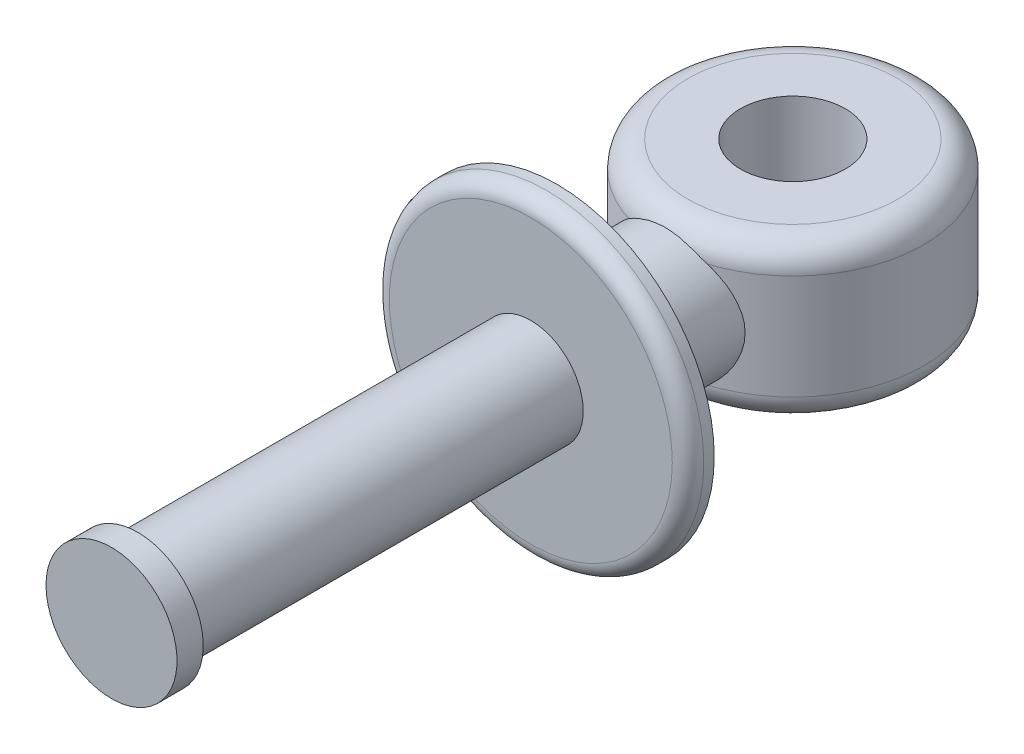
ISO-10303-21;
HEADER;
FILE_DESCRIPTION(('STEP AP214'),'2;1');
FILE_NAME('part.step','',(''),(''),'','','');
FILE_SCHEMA(('AUTOMOTIVE_DESIGN { 1 0 10303 214 1 1 1 1 }'));
ENDSEC;
DATA;
#1=APPLICATION_CONTEXT('core data for automotive mechanical design processes');
#2=APPLICATION_PROTOCOL_DEFINITION('international standard','automotive_design',2000,#1);
#3=PRODUCT_CONTEXT('',#1,'mechanical');
#4=PRODUCT('Part','Part','',(#3));
#5=PRODUCT_RELATED_PRODUCT_CATEGORY('part','',(#4));
#6=PRODUCT_DEFINITION_FORMATION('','',#4);
#7=PRODUCT_DEFINITION_CONTEXT('part definition',#1,'design');
#8=PRODUCT_DEFINITION('design','',#6,#7);
#9=PRODUCT_DEFINITION_SHAPE('','',#8);
#10=(LENGTH_UNIT() NAMED_UNIT(*) SI_UNIT(.MILLI.,.METRE.));
#11=(NAMED_UNIT(*) PLANE_ANGLE_UNIT() SI_UNIT($,.RADIAN.));
#12=(NAMED_UNIT(*) SI_UNIT($,.STERADIAN.) SOLID_ANGLE_UNIT());
#13=UNCERTAINTY_MEASURE_WITH_UNIT(LENGTH_MEASURE(1.E-05),#10,'distance_accuracy_value','');
#14=(GEOMETRIC_REPRESENTATION_CONTEXT(3) GLOBAL_UNCERTAINTY_ASSIGNED_CONTEXT((#13)) GLOBAL_UNIT_ASSIGNED_CONTEXT((#10,
#11,#12)) REPRESENTATION_CONTEXT('',''));
#15=CARTESIAN_POINT('',(0.,0.,0.));
#16=DIRECTION('',(0.,0.,1.));
#17=DIRECTION('',(1.,0.,0.));
#18=AXIS2_PLACEMENT_3D('',#15,#16,#17);
#19=CARTESIAN_POINT('',(0.,7.5,-62.5));
#20=DIRECTION('',(0.,-1.,0.));
#21=DIRECTION('',(0.,0.,1.));
#22=AXIS2_PLACEMENT_3D('',#19,#20,#21);
#23=CYLINDRICAL_SURFACE('',#22,12.5);
#24=CARTESIAN_POINT('',(0.,-5.,-62.5));
#25=DIRECTION('',(0.,-1.,0.));
#26=DIRECTION('',(0.,0.,-1.));
#27=AXIS2_PLACEMENT_3D('',#24,#25,#26);
#28=CIRCLE('',#27,12.5);
#29=CARTESIAN_POINT('',(0.,-5.,-75.));
#30=VERTEX_POINT('',#29);
#31=EDGE_CURVE('E54',#30,#30,#28,.T.);
#32=ORIENTED_EDGE('',*,*,#31,.F.);
#33=EDGE_LOOP('',(#32));
#34=FACE_BOUND('',#33,.T.);
#35=CARTESIAN_POINT('',(0.,5.,-62.5));
#36=DIRECTION('',(0.,-1.,0.));
#37=DIRECTION('',(0.,0.,-1.));
#38=AXIS2_PLACEMENT_3D('',#35,#36,#37);
#39=CIRCLE('',#38,12.5);
#40=CARTESIAN_POINT('',(0.,5.,-75.));
#41=VERTEX_POINT('',#40);
#42=EDGE_CURVE('E58',#41,#41,#39,.F.);
#43=ORIENTED_EDGE('',*,*,#42,.F.);
#44=EDGE_LOOP('',(#43));
#45=FACE_BOUND('',#44,.T.);
#46=ADVANCED_FACE('F43',(#34,#45),#23,.T.);
#47=CARTESIAN_POINT('',(0.,7.5,-62.5));
#48=DIRECTION('',(0.,1.,0.));
#49=DIRECTION('',(0.,0.,-1.));
#50=AXIS2_PLACEMENT_3D('',#47,#48,#49);
#51=PLANE('',#50);
#52=CARTESIAN_POINT('',(0.,7.5,-62.5));
#53=DIRECTION('',(0.,-1.,0.));
#54=DIRECTION('',(0.,0.,-1.));
#55=AXIS2_PLACEMENT_3D('',#52,#53,#54);
#56=CIRCLE('',#55,10.);
#57=CARTESIAN_POINT('',(0.,7.5,-72.5));
#58=VERTEX_POINT('',#57);
#59=EDGE_CURVE('E11',#58,#58,#56,.T.);
#60=ORIENTED_EDGE('',*,*,#59,.F.);
#61=EDGE_LOOP('',(#60));
#62=FACE_BOUND('',#61,.T.);
#63=CARTESIAN_POINT('',(0.,7.5,-62.5));
#64=DIRECTION('',(0.,-1.,0.));
#65=DIRECTION('',(0.,0.,-1.));
#66=AXIS2_PLACEMENT_3D('',#63,#64,#65);
#67=CIRCLE('',#66,5.);
#68=CARTESIAN_POINT('',(0.,7.5,-67.5));
#69=VERTEX_POINT('',#68);
#70=EDGE_CURVE('E66',#69,#69,#67,.T.);
#71=ORIENTED_EDGE('',*,*,#70,.T.);
#72=EDGE_LOOP('',(#71));
#73=FACE_BOUND('',#72,.T.);
#74=ADVANCED_FACE('F70',(#62,#73),#51,.T.);
#75=CARTESIAN_POINT('',(0.,-7.5,-62.5));
#76=DIRECTION('',(0.,1.,0.));
#77=DIRECTION('',(0.,0.,-1.));
#78=AXIS2_PLACEMENT_3D('',#75,#76,#77);
#79=PLANE('',#78);
#80=CARTESIAN_POINT('',(0.,-7.5,-62.5));
#81=DIRECTION('',(0.,-1.,0.));
#82=DIRECTION('',(0.,0.,-1.));
#83=AXIS2_PLACEMENT_3D('',#80,#81,#82);
#84=CIRCLE('',#83,10.);
#85=CARTESIAN_POINT('',(0.,-7.5,-72.5));
#86=VERTEX_POINT('',#85);
#87=EDGE_CURVE('E50',#86,#86,#84,.F.);
#88=ORIENTED_EDGE('',*,*,#87,.F.);
#89=EDGE_LOOP('',(#88));
#90=FACE_BOUND('',#89,.T.);
#91=CARTESIAN_POINT('',(0.,-7.5,-62.5));
#92=DIRECTION('',(0.,-1.,0.));
#93=DIRECTION('',(0.,0.,-1.));
#94=AXIS2_PLACEMENT_3D('',#91,#92,#93);
#95=CIRCLE('',#94,5.);
#96=CARTESIAN_POINT('',(0.,-7.5,-67.5));
#97=VERTEX_POINT('',#96);
#98=EDGE_CURVE('E63',#97,#97,#95,.T.);
#99=ORIENTED_EDGE('',*,*,#98,.F.);
#100=EDGE_LOOP('',(#99));
#101=FACE_BOUND('',#100,.T.);
#102=ADVANCED_FACE('F76',(#90,#101),#79,.F.);
#103=CARTESIAN_POINT('',(0.,-15.,-62.5));
#104=DIRECTION('',(0.,1.,0.));
#105=DIRECTION('',(0.,0.,-1.));
#106=AXIS2_PLACEMENT_3D('',#103,#104,#105);
#107=CYLINDRICAL_SURFACE('',#106,5.);
#108=CARTESIAN_POINT('',(0.,7.5,-67.5));
#109=CARTESIAN_POINT('',(0.,7.34375,-67.5));
#110=CARTESIAN_POINT('',(0.,7.1875,-67.5));
#111=CARTESIAN_POINT('',(0.,6.875,-67.5));
#112=CARTESIAN_POINT('',(0.,6.71875,-67.5));
#113=CARTESIAN_POINT('',(0.,6.40625,-67.5));
#114=CARTESIAN_POINT('',(0.,6.25,-67.5));
#115=CARTESIAN_POINT('',(0.,5.9375,-67.5));
#116=CARTESIAN_POINT('',(0.,5.78125,-67.5));
#117=CARTESIAN_POINT('',(0.,5.46875,-67.5));
#118=CARTESIAN_POINT('',(0.,5.3125,-67.5));
#119=CARTESIAN_POINT('',(0.,5.,-67.5));
#120=CARTESIAN_POINT('',(0.,4.84375,-67.5));
#121=CARTESIAN_POINT('',(0.,4.53125,-67.5));
#122=CARTESIAN_POINT('',(0.,4.375,-67.5));
#123=CARTESIAN_POINT('',(0.,4.0625,-67.5));
#124=CARTESIAN_POINT('',(0.,3.90625,-67.5));
#125=CARTESIAN_POINT('',(0.,3.59375,-67.5));
#126=CARTESIAN_POINT('',(0.,3.4375,-67.5));
#127=CARTESIAN_POINT('',(0.,3.125,-67.5));
#128=CARTESIAN_POINT('',(0.,2.96875,-67.5));
#129=CARTESIAN_POINT('',(0.,2.65625,-67.5));
#130=CARTESIAN_POINT('',(0.,2.5,-67.5));
#131=CARTESIAN_POINT('',(0.,2.1875,-67.5));
#132=CARTESIAN_POINT('',(0.,2.03125,-67.5));
#133=CARTESIAN_POINT('',(0.,1.71875,-67.5));
#134=CARTESIAN_POINT('',(0.,1.5625,-67.5));
#135=CARTESIAN_POINT('',(0.,1.25,-67.5));
#136=CARTESIAN_POINT('',(0.,1.09375,-67.5));
#137=CARTESIAN_POINT('',(0.,0.781250000000001,-67.5));
#138=CARTESIAN_POINT('',(0.,0.625000000000002,-67.5));
#139=CARTESIAN_POINT('',(0.,0.312500000000002,-67.5));
#140=CARTESIAN_POINT('',(0.,0.156250000000002,-67.5));
#141=CARTESIAN_POINT('',(0.,-0.156249999999998,-67.5));
#142=CARTESIAN_POINT('',(0.,-0.312499999999997,-67.5));
#143=CARTESIAN_POINT('',(0.,-0.624999999999997,-67.5));
#144=CARTESIAN_POINT('',(0.,-0.781249999999997,-67.5));
#145=CARTESIAN_POINT('',(0.,-1.09375,-67.5));
#146=CARTESIAN_POINT('',(0.,-1.25,-67.5));
#147=CARTESIAN_POINT('',(0.,-1.5625,-67.5));
#148=CARTESIAN_POINT('',(0.,-1.71875,-67.5));
#149=CARTESIAN_POINT('',(0.,-2.03125,-67.5));
#150=CARTESIAN_POINT('',(0.,-2.1875,-67.5));
#151=CARTESIAN_POINT('',(0.,-2.5,-67.5));
#152=CARTESIAN_POINT('',(0.,-2.65625,-67.5));
#153=CARTESIAN_POINT('',(0.,-2.96875,-67.5));
#154=CARTESIAN_POINT('',(0.,-3.125,-67.5));
#155=CARTESIAN_POINT('',(0.,-3.4375,-67.5));
#156=CARTESIAN_POINT('',(0.,-3.59375,-67.5));
#157=CARTESIAN_POINT('',(0.,-3.90625,-67.5));
#158=CARTESIAN_POINT('',(0.,-4.0625,-67.5));
#159=CARTESIAN_POINT('',(0.,-4.375,-67.5));
#160=CARTESIAN_POINT('',(0.,-4.53125,-67.5));
#161=CARTESIAN_POINT('',(0.,-4.84375,-67.5));
#162=CARTESIAN_POINT('',(0.,-5.,-67.5));
#163=CARTESIAN_POINT('',(0.,-5.3125,-67.5));
#164=CARTESIAN_POINT('',(0.,-5.46875,-67.5));
#165=CARTESIAN_POINT('',(0.,-5.78125,-67.5));
#166=CARTESIAN_POINT('',(0.,-5.9375,-67.5));
#167=CARTESIAN_POINT('',(0.,-6.25,-67.5));
#168=CARTESIAN_POINT('',(0.,-6.40625,-67.5));
#169=CARTESIAN_POINT('',(0.,-6.71875,-67.5));
#170=CARTESIAN_POINT('',(0.,-6.875,-67.5));
#171=CARTESIAN_POINT('',(0.,-7.1875,-67.5));
#172=CARTESIAN_POINT('',(0.,-7.34375,-67.5));
#173=CARTESIAN_POINT('',(0.,-7.5,-67.5));
#174=B_SPLINE_CURVE_WITH_KNOTS('',3,(#108,#109,#110,#111,#112,#113,#114,#115,#116,#117,#118,
#119,#120,#121,#122,#123,#124,#125,#126,#127,#128,#129,#130,#131,#132,#133,#134,#135,#136,#137,
#138,#139,#140,#141,#142,#143,#144,#145,#146,#147,#148,#149,#150,#151,#152,#153,#154,#155,#156,
#157,#158,#159,#160,#161,#162,#163,#164,#165,#166,#167,#168,#169,#170,#171,#172,#173),
.UNSPECIFIED.,.F.,.F.,(4,2,2,2,2,2,2,2,2,2,2,2,2,2,2,2,2,2,2,2,2,2,2,2,2,2,2,2,2,2,2,2,4),(0.,
0.46875,0.937500000000001,1.40625,1.875,2.34375,2.8125,3.28125,3.75,4.21875,4.6875,5.15625,
5.625,6.09375,6.5625,7.03125,7.5,7.96875,8.4375,8.90625,9.375,9.84375,10.3125,10.78125,11.25,
11.71875,12.1875,12.65625,13.125,13.59375,14.0625,14.53125,15.),.UNSPECIFIED.);
#175=EDGE_CURVE('BSEAM72',#69,#97,#174,.T.);
#176=ORIENTED_EDGE('',*,*,#70,.F.);
#177=ORIENTED_EDGE('',*,*,#98,.T.);
#178=ORIENTED_EDGE('',*,*,#175,.T.);
#179=ORIENTED_EDGE('',*,*,#175,.F.);
#180=EDGE_LOOP('',(#176,#178,#177,#179));
#181=FACE_BOUND('',#180,.T.);
#182=ADVANCED_FACE('F72',(#181),#107,.F.);
#183=CARTESIAN_POINT('',(0.,-5.,-62.5));
#184=DIRECTION('',(0.,1.,0.));
#185=DIRECTION('',(0.,0.,-1.));
#186=AXIS2_PLACEMENT_3D('',#183,#184,#185);
#187=TOROIDAL_SURFACE('',#186,10.,2.5);
#188=ORIENTED_EDGE('',*,*,#87,.T.);
#189=EDGE_LOOP('',(#188));
#190=FACE_BOUND('',#189,.T.);
#191=ORIENTED_EDGE('',*,*,#31,.T.);
#192=EDGE_LOOP('',(#191));
#193=FACE_BOUND('',#192,.T.);
#194=ADVANCED_FACE('F75',(#190,#193),#187,.T.);
#195=CARTESIAN_POINT('',(0.,5.,-62.5));
#196=DIRECTION('',(0.,1.,0.));
#197=DIRECTION('',(0.,0.,-1.));
#198=AXIS2_PLACEMENT_3D('',#195,#196,#197);
#199=TOROIDAL_SURFACE('',#198,10.,2.5);
#200=ORIENTED_EDGE('',*,*,#42,.T.);
#201=EDGE_LOOP('',(#200));
#202=FACE_BOUND('',#201,.T.);
#203=ORIENTED_EDGE('',*,*,#59,.T.);
#204=EDGE_LOOP('',(#203));
#205=FACE_BOUND('',#204,.T.);
#206=ADVANCED_FACE('F45',(#202,#205),#199,.T.);
#207=CLOSED_SHELL('',(#46,#74,#102,#182,#194,#206));
#208=MANIFOLD_SOLID_BREP('B2',#207);
#209=CARTESIAN_POINT('',(0.,0.,-40.));
#210=DIRECTION('',(0.,0.,-1.));
#211=DIRECTION('',(1.,0.,0.));
#212=AXIS2_PLACEMENT_3D('',#209,#210,#211);
#213=PLANE('',#212);
#214=CARTESIAN_POINT('',(0.,0.,-40.));
#215=DIRECTION('',(0.,0.,1.));
#216=DIRECTION('',(1.,0.,0.));
#217=AXIS2_PLACEMENT_3D('',#214,#215,#216);
#218=CIRCLE('',#217,8.75);
#219=CARTESIAN_POINT('',(8.75,0.,-40.));
#220=VERTEX_POINT('',#219);
#221=EDGE_CURVE('E146',#220,#220,#218,.F.);
#222=ORIENTED_EDGE('',*,*,#221,.F.);
#223=EDGE_LOOP('',(#222));
#224=FACE_BOUND('',#223,.T.);
#225=CARTESIAN_POINT('',(0.,0.,-40.));
#226=DIRECTION('',(0.,0.,1.));
#227=DIRECTION('',(1.,0.,0.));
#228=AXIS2_PLACEMENT_3D('',#225,#226,#227);
#229=CIRCLE('',#228,15.);
#230=CARTESIAN_POINT('',(15.,0.,-40.));
#231=VERTEX_POINT('',#230);
#232=EDGE_CURVE('E165',#231,#231,#229,.T.);
#233=ORIENTED_EDGE('',*,*,#232,.F.);
#234=EDGE_LOOP('',(#233));
#235=FACE_BOUND('',#234,.T.);
#236=ADVANCED_FACE('F135',(#224,#235),#213,.T.);
#237=CARTESIAN_POINT('',(0.,0.,-37.5));
#238=DIRECTION('',(0.,0.,1.));
#239=DIRECTION('',(-1.,0.,0.));
#240=AXIS2_PLACEMENT_3D('',#237,#238,#239);
#241=CYLINDRICAL_SURFACE('',#240,5.);
#242=CARTESIAN_POINT('',(0.,0.,-37.5));
#243=DIRECTION('',(0.,0.,1.));
#244=DIRECTION('',(1.,0.,0.));
#245=AXIS2_PLACEMENT_3D('',#242,#243,#244);
#246=CIRCLE('',#245,5.);
#247=CARTESIAN_POINT('',(5.,0.,-37.5));
#248=VERTEX_POINT('',#247);
#249=EDGE_CURVE('E155',#248,#248,#246,.T.);
#250=ORIENTED_EDGE('',*,*,#249,.T.);
#251=EDGE_LOOP('',(#250));
#252=FACE_BOUND('',#251,.T.);
#253=CARTESIAN_POINT('',(0.,0.,0.));
#254=DIRECTION('',(0.,0.,-1.));
#255=DIRECTION('',(-1.,0.,0.));
#256=AXIS2_PLACEMENT_3D('',#253,#254,#255);
#257=CIRCLE('',#256,5.);
#258=CARTESIAN_POINT('',(-5.,0.,0.));
#259=VERTEX_POINT('',#258);
#260=EDGE_CURVE('E158',#259,#259,#257,.T.);
#261=ORIENTED_EDGE('',*,*,#260,.T.);
#262=EDGE_LOOP('',(#261));
#263=FACE_BOUND('',#262,.T.);
#264=ADVANCED_FACE('F189',(#252,#263),#241,.T.);
#265=CARTESIAN_POINT('',(0.,0.,0.));
#266=DIRECTION('',(0.,0.,1.));
#267=DIRECTION('',(-1.,0.,0.));
#268=AXIS2_PLACEMENT_3D('',#265,#266,#267);
#269=PLANE('',#268);
#270=CARTESIAN_POINT('',(0.,0.,0.));
#271=DIRECTION('',(0.,0.,-1.));
#272=DIRECTION('',(-1.,0.,0.));
#273=AXIS2_PLACEMENT_3D('',#270,#271,#272);
#274=CIRCLE('',#273,6.25);
#275=CARTESIAN_POINT('',(-6.25,0.,0.));
#276=VERTEX_POINT('',#275);
#277=EDGE_CURVE('E162',#276,#276,#274,.T.);
#278=ORIENTED_EDGE('',*,*,#277,.T.);
#279=EDGE_LOOP('',(#278));
#280=FACE_BOUND('',#279,.T.);
#281=ORIENTED_EDGE('',*,*,#260,.F.);
#282=EDGE_LOOP('',(#281));
#283=FACE_BOUND('',#282,.T.);
#284=ADVANCED_FACE('F195',(#280,#283),#269,.F.);
#285=CARTESIAN_POINT('',(0.,0.,2.5));
#286=DIRECTION('',(0.,0.,-1.));
#287=DIRECTION('',(1.,0.,0.));
#288=AXIS2_PLACEMENT_3D('',#285,#286,#287);
#289=CYLINDRICAL_SURFACE('',#288,6.25);
#290=CARTESIAN_POINT('',(0.,0.,2.5));
#291=DIRECTION('',(0.,0.,-1.));
#292=DIRECTION('',(-1.,0.,0.));
#293=AXIS2_PLACEMENT_3D('',#290,#291,#292);
#294=CIRCLE('',#293,6.25);
#295=CARTESIAN_POINT('',(-6.25,0.,2.5));
#296=VERTEX_POINT('',#295);
#297=EDGE_CURVE('E161',#296,#296,#294,.T.);
#298=ORIENTED_EDGE('',*,*,#297,.T.);
#299=EDGE_LOOP('',(#298));
#300=FACE_BOUND('',#299,.T.);
#301=ORIENTED_EDGE('',*,*,#277,.F.);
#302=EDGE_LOOP('',(#301));
#303=FACE_BOUND('',#302,.T.);
#304=ADVANCED_FACE('F211',(#300,#303),#289,.T.);
#305=CARTESIAN_POINT('',(0.,0.,2.5));
#306=DIRECTION('',(0.,0.,1.));
#307=DIRECTION('',(-1.,0.,0.));
#308=AXIS2_PLACEMENT_3D('',#305,#306,#307);
#309=PLANE('',#308);
#310=ORIENTED_EDGE('',*,*,#297,.F.);
#311=EDGE_LOOP('',(#310));
#312=FACE_BOUND('',#311,.T.);
#313=ADVANCED_FACE('F204',(#312),#309,.T.);
#314=CARTESIAN_POINT('',(0.,0.,-37.5));
#315=DIRECTION('',(0.,0.,-1.));
#316=DIRECTION('',(1.,0.,0.));
#317=AXIS2_PLACEMENT_3D('',#314,#315,#316);
#318=PLANE('',#317);
#319=CARTESIAN_POINT('',(0.,0.,-37.5));
#320=DIRECTION('',(0.,0.,1.));
#321=DIRECTION('',(1.,0.,0.));
#322=AXIS2_PLACEMENT_3D('',#319,#320,#321);
#323=CIRCLE('',#322,13.5);
#324=CARTESIAN_POINT('',(13.5,0.,-37.5));
#325=VERTEX_POINT('',#324);
#326=EDGE_CURVE('E42',#325,#325,#323,.F.);
#327=ORIENTED_EDGE('',*,*,#326,.F.);
#328=EDGE_LOOP('',(#327));
#329=FACE_BOUND('',#328,.T.);
#330=ORIENTED_EDGE('',*,*,#249,.F.);
#331=EDGE_LOOP('',(#330));
#332=FACE_BOUND('',#331,.T.);
#333=ADVANCED_FACE('F201',(#329,#332),#318,.F.);
#334=CARTESIAN_POINT('',(0.,0.,-40.));
#335=DIRECTION('',(0.,0.,1.));
#336=DIRECTION('',(-1.,0.,0.));
#337=AXIS2_PLACEMENT_3D('',#334,#335,#336);
#338=CYLINDRICAL_SURFACE('',#337,15.);
#339=CARTESIAN_POINT('',(0.,0.,-39.));
#340=DIRECTION('',(0.,0.,1.));
#341=DIRECTION('',(1.,0.,0.));
#342=AXIS2_PLACEMENT_3D('',#339,#340,#341);
#343=CIRCLE('',#342,15.);
#344=CARTESIAN_POINT('',(15.,0.,-39.));
#345=VERTEX_POINT('',#344);
#346=EDGE_CURVE('E142',#345,#345,#343,.T.);
#347=ORIENTED_EDGE('',*,*,#346,.F.);
#348=EDGE_LOOP('',(#347));
#349=FACE_BOUND('',#348,.T.);
#350=ORIENTED_EDGE('',*,*,#232,.T.);
#351=EDGE_LOOP('',(#350));
#352=FACE_BOUND('',#351,.T.);
#353=ADVANCED_FACE('F185',(#349,#352),#338,.T.);
#354=CARTESIAN_POINT('',(0.,0.,-55.));
#355=DIRECTION('',(0.,0.,1.));
#356=DIRECTION('',(-1.,0.,0.));
#357=AXIS2_PLACEMENT_3D('',#354,#355,#356);
#358=CYLINDRICAL_SURFACE('',#357,6.25);
#359=CARTESIAN_POINT('',(0.,0.,-42.5));
#360=DIRECTION('',(0.,0.,1.));
#361=DIRECTION('',(1.,0.,0.));
#362=AXIS2_PLACEMENT_3D('',#359,#360,#361);
#363=CIRCLE('',#362,6.25);
#364=CARTESIAN_POINT('',(6.25,0.,-42.5));
#365=VERTEX_POINT('',#364);
#366=EDGE_CURVE('E150',#365,#365,#363,.T.);
#367=ORIENTED_EDGE('',*,*,#366,.F.);
#368=EDGE_LOOP('',(#367));
#369=FACE_BOUND('',#368,.T.);
#370=CARTESIAN_POINT('',(0.,0.,-55.));
#371=DIRECTION('',(0.,0.,1.));
#372=DIRECTION('',(1.,0.,0.));
#373=AXIS2_PLACEMENT_3D('',#370,#371,#372);
#374=CIRCLE('',#373,6.25);
#375=CARTESIAN_POINT('',(6.25,0.,-55.));
#376=VERTEX_POINT('',#375);
#377=EDGE_CURVE('E170',#376,#376,#374,.T.);
#378=ORIENTED_EDGE('',*,*,#377,.T.);
#379=EDGE_LOOP('',(#378));
#380=FACE_BOUND('',#379,.T.);
#381=ADVANCED_FACE('F174',(#369,#380),#358,.T.);
#382=CARTESIAN_POINT('',(0.,0.,-55.));
#383=DIRECTION('',(0.,0.,-1.));
#384=DIRECTION('',(1.,0.,0.));
#385=AXIS2_PLACEMENT_3D('',#382,#383,#384);
#386=PLANE('',#385);
#387=ORIENTED_EDGE('',*,*,#377,.F.);
#388=EDGE_LOOP('',(#387));
#389=FACE_BOUND('',#388,.T.);
#390=ADVANCED_FACE('F176',(#389),#386,.T.);
#391=CARTESIAN_POINT('',(0.,0.,-42.5));
#392=DIRECTION('',(0.,0.,-1.));
#393=DIRECTION('',(1.,0.,0.));
#394=AXIS2_PLACEMENT_3D('',#391,#392,#393);
#395=TOROIDAL_SURFACE('',#394,8.75,2.5);
#396=ORIENTED_EDGE('',*,*,#221,.T.);
#397=EDGE_LOOP('',(#396));
#398=FACE_BOUND('',#397,.T.);
#399=ORIENTED_EDGE('',*,*,#366,.T.);
#400=EDGE_LOOP('',(#399));
#401=FACE_BOUND('',#400,.T.);
#402=ADVANCED_FACE('F178',(#398,#401),#395,.F.);
#403=CARTESIAN_POINT('',(0.,0.,-39.));
#404=DIRECTION('',(0.,0.,-1.));
#405=DIRECTION('',(1.,0.,0.));
#406=AXIS2_PLACEMENT_3D('',#403,#404,#405);
#407=TOROIDAL_SURFACE('',#406,13.5,1.5);
#408=ORIENTED_EDGE('',*,*,#326,.T.);
#409=EDGE_LOOP('',(#408));
#410=FACE_BOUND('',#409,.T.);
#411=ORIENTED_EDGE('',*,*,#346,.T.);
#412=EDGE_LOOP('',(#411));
#413=FACE_BOUND('',#412,.T.);
#414=ADVANCED_FACE('F137',(#410,#413),#407,.T.);
#415=CLOSED_SHELL('',(#236,#264,#284,#304,#313,#333,#353,#381,#390,#402,#414));
#416=MANIFOLD_SOLID_BREP('B6',#415);
#417=ADVANCED_BREP_SHAPE_REPRESENTATION('',(#18,#208,#416),#14);
#418=SHAPE_DEFINITION_REPRESENTATION(#9,#417);
ENDSEC;
END-ISO-10303-21;
